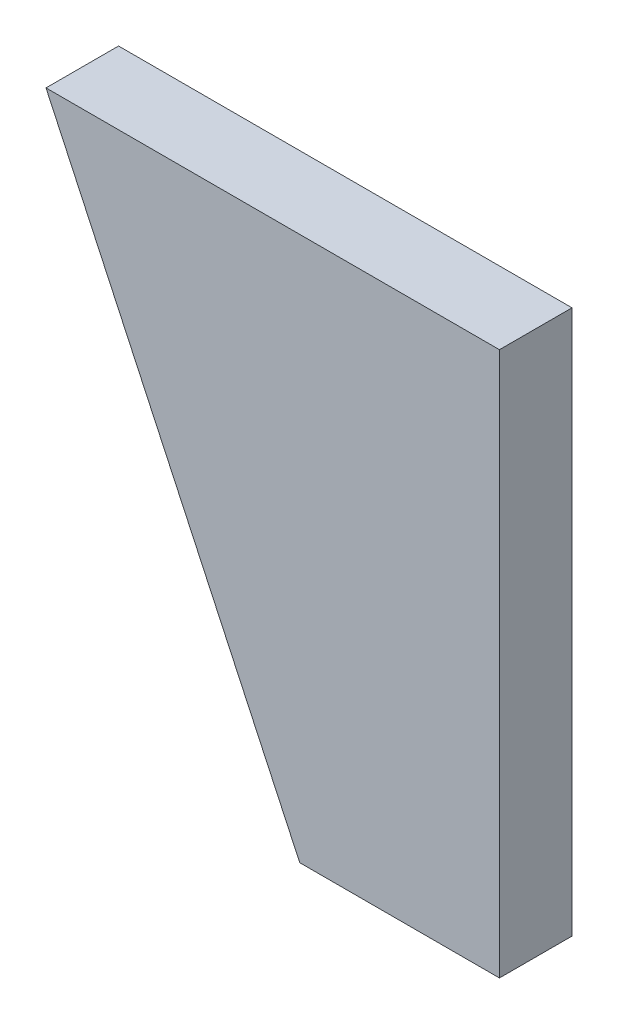
ISO-10303-21;
HEADER;
FILE_DESCRIPTION(('STEP AP214'),'2;1');
FILE_NAME('part.step','',(''),(''),'','','');
FILE_SCHEMA(('AUTOMOTIVE_DESIGN { 1 0 10303 214 1 1 1 1 }'));
ENDSEC;
DATA;
#1=APPLICATION_CONTEXT('core data for automotive mechanical design processes');
#2=APPLICATION_PROTOCOL_DEFINITION('international standard','automotive_design',2000,#1);
#3=PRODUCT_CONTEXT('',#1,'mechanical');
#4=PRODUCT('Part','Part','',(#3));
#5=PRODUCT_RELATED_PRODUCT_CATEGORY('part','',(#4));
#6=PRODUCT_DEFINITION_FORMATION('','',#4);
#7=PRODUCT_DEFINITION_CONTEXT('part definition',#1,'design');
#8=PRODUCT_DEFINITION('design','',#6,#7);
#9=PRODUCT_DEFINITION_SHAPE('','',#8);
#10=(LENGTH_UNIT() NAMED_UNIT(*) SI_UNIT(.MILLI.,.METRE.));
#11=(NAMED_UNIT(*) PLANE_ANGLE_UNIT() SI_UNIT($,.RADIAN.));
#12=(NAMED_UNIT(*) SI_UNIT($,.STERADIAN.) SOLID_ANGLE_UNIT());
#13=UNCERTAINTY_MEASURE_WITH_UNIT(LENGTH_MEASURE(1.E-05),#10,'distance_accuracy_value','');
#14=(GEOMETRIC_REPRESENTATION_CONTEXT(3) GLOBAL_UNCERTAINTY_ASSIGNED_CONTEXT((#13)) GLOBAL_UNIT_ASSIGNED_CONTEXT((#10,
#11,#12)) REPRESENTATION_CONTEXT('',''));
#15=CARTESIAN_POINT('',(0.,0.,0.));
#16=DIRECTION('',(0.,0.,1.));
#17=DIRECTION('',(1.,0.,0.));
#18=AXIS2_PLACEMENT_3D('',#15,#16,#17);
#19=CARTESIAN_POINT('',(41.9892297446501,55.,2.));
#20=DIRECTION('',(0.,1.,0.));
#21=DIRECTION('',(0.,0.,1.));
#22=AXIS2_PLACEMENT_3D('',#19,#20,#21);
#23=PLANE('',#22);
#24=DIRECTION('',(1.,0.,0.));
#25=VECTOR('',#24,1.);
#26=CARTESIAN_POINT('',(41.9892297446501,55.,-2.));
#27=LINE('',#26,#25);
#28=CARTESIAN_POINT('',(41.9892297446501,55.,-2.));
#29=VERTEX_POINT('',#28);
#30=CARTESIAN_POINT('',(53.,55.,-2.));
#31=VERTEX_POINT('',#30);
#32=EDGE_CURVE('E98',#29,#31,#27,.T.);
#33=ORIENTED_EDGE('',*,*,#32,.T.);
#34=DIRECTION('',(0.,0.,-1.));
#35=VECTOR('',#34,1.);
#36=CARTESIAN_POINT('',(53.,55.,2.));
#37=LINE('',#36,#35);
#38=CARTESIAN_POINT('',(53.,55.,2.));
#39=VERTEX_POINT('',#38);
#40=EDGE_CURVE('E11',#39,#31,#37,.T.);
#41=ORIENTED_EDGE('',*,*,#40,.F.);
#42=DIRECTION('',(1.,0.,0.));
#43=VECTOR('',#42,1.);
#44=CARTESIAN_POINT('',(41.9892297446501,55.,2.));
#45=LINE('',#44,#43);
#46=CARTESIAN_POINT('',(41.9892297446501,55.,2.));
#47=VERTEX_POINT('',#46);
#48=EDGE_CURVE('E77',#47,#39,#45,.T.);
#49=ORIENTED_EDGE('',*,*,#48,.F.);
#50=DIRECTION('',(0.,0.,-1.));
#51=VECTOR('',#50,1.);
#52=CARTESIAN_POINT('',(41.9892297446501,55.,2.));
#53=LINE('',#52,#51);
#54=EDGE_CURVE('E97',#47,#29,#53,.T.);
#55=ORIENTED_EDGE('',*,*,#54,.T.);
#56=EDGE_LOOP('',(#33,#41,#49,#55));
#57=FACE_BOUND('',#56,.T.);
#58=ADVANCED_FACE('F35',(#57),#23,.F.);
#59=CARTESIAN_POINT('',(53.,85.,2.));
#60=DIRECTION('',(1.,0.,0.));
#61=DIRECTION('',(0.,1.,0.));
#62=AXIS2_PLACEMENT_3D('',#59,#60,#61);
#63=PLANE('',#62);
#64=DIRECTION('',(0.,-1.,0.));
#65=VECTOR('',#64,1.);
#66=CARTESIAN_POINT('',(53.,85.,-2.));
#67=LINE('',#66,#65);
#68=CARTESIAN_POINT('',(53.,85.,-2.));
#69=VERTEX_POINT('',#68);
#70=EDGE_CURVE('E87',#69,#31,#67,.T.);
#71=ORIENTED_EDGE('',*,*,#70,.F.);
#72=DIRECTION('',(0.,0.,-1.));
#73=VECTOR('',#72,1.);
#74=CARTESIAN_POINT('',(53.,85.,2.));
#75=LINE('',#74,#73);
#76=CARTESIAN_POINT('',(53.,85.,2.));
#77=VERTEX_POINT('',#76);
#78=EDGE_CURVE('E43',#77,#69,#75,.T.);
#79=ORIENTED_EDGE('',*,*,#78,.F.);
#80=DIRECTION('',(0.,-1.,0.));
#81=VECTOR('',#80,1.);
#82=CARTESIAN_POINT('',(53.,85.,2.));
#83=LINE('',#82,#81);
#84=EDGE_CURVE('E85',#77,#39,#83,.T.);
#85=ORIENTED_EDGE('',*,*,#84,.T.);
#86=ORIENTED_EDGE('',*,*,#40,.T.);
#87=EDGE_LOOP('',(#71,#79,#85,#86));
#88=FACE_BOUND('',#87,.T.);
#89=ADVANCED_FACE('F84',(#88),#63,.T.);
#90=CARTESIAN_POINT('',(53.,85.,2.));
#91=DIRECTION('',(0.,-1.,0.));
#92=DIRECTION('',(0.,0.,-1.));
#93=AXIS2_PLACEMENT_3D('',#90,#91,#92);
#94=PLANE('',#93);
#95=DIRECTION('',(-1.,0.,0.));
#96=VECTOR('',#95,1.);
#97=CARTESIAN_POINT('',(53.,85.,-2.));
#98=LINE('',#97,#96);
#99=CARTESIAN_POINT('',(28.,85.,-2.));
#100=VERTEX_POINT('',#99);
#101=EDGE_CURVE('E66',#69,#100,#98,.T.);
#102=ORIENTED_EDGE('',*,*,#101,.T.);
#103=DIRECTION('',(0.,0.,-1.));
#104=VECTOR('',#103,1.);
#105=CARTESIAN_POINT('',(28.,85.,2.));
#106=LINE('',#105,#104);
#107=CARTESIAN_POINT('',(28.,85.,2.));
#108=VERTEX_POINT('',#107);
#109=EDGE_CURVE('E88',#108,#100,#106,.T.);
#110=ORIENTED_EDGE('',*,*,#109,.F.);
#111=DIRECTION('',(-1.,0.,0.));
#112=VECTOR('',#111,1.);
#113=CARTESIAN_POINT('',(53.,85.,2.));
#114=LINE('',#113,#112);
#115=EDGE_CURVE('E89',#77,#108,#114,.T.);
#116=ORIENTED_EDGE('',*,*,#115,.F.);
#117=ORIENTED_EDGE('',*,*,#78,.T.);
#118=EDGE_LOOP('',(#102,#110,#116,#117));
#119=FACE_BOUND('',#118,.T.);
#120=ADVANCED_FACE('F90',(#119),#94,.F.);
#121=CARTESIAN_POINT('',(28.,85.,2.));
#122=DIRECTION('',(0.906307787036649,0.422618261740701,0.));
#123=DIRECTION('',(-0.422618261740701,0.906307787036649,0.));
#124=AXIS2_PLACEMENT_3D('',#121,#122,#123);
#125=PLANE('',#124);
#126=DIRECTION('',(0.422618261740701,-0.906307787036649,0.));
#127=VECTOR('',#126,1.);
#128=CARTESIAN_POINT('',(28.,85.,-2.));
#129=LINE('',#128,#127);
#130=EDGE_CURVE('E72',#100,#29,#129,.T.);
#131=ORIENTED_EDGE('',*,*,#130,.T.);
#132=ORIENTED_EDGE('',*,*,#54,.F.);
#133=DIRECTION('',(0.422618261740701,-0.906307787036649,0.));
#134=VECTOR('',#133,1.);
#135=CARTESIAN_POINT('',(28.,85.,2.));
#136=LINE('',#135,#134);
#137=EDGE_CURVE('E51',#108,#47,#136,.T.);
#138=ORIENTED_EDGE('',*,*,#137,.F.);
#139=ORIENTED_EDGE('',*,*,#109,.T.);
#140=EDGE_LOOP('',(#131,#132,#138,#139));
#141=FACE_BOUND('',#140,.T.);
#142=ADVANCED_FACE('F105',(#141),#125,.F.);
#143=CARTESIAN_POINT('',(0.,0.,2.));
#144=DIRECTION('',(0.,0.,-1.));
#145=DIRECTION('',(-1.,0.,0.));
#146=AXIS2_PLACEMENT_3D('',#143,#144,#145);
#147=PLANE('',#146);
#148=ORIENTED_EDGE('',*,*,#48,.T.);
#149=ORIENTED_EDGE('',*,*,#84,.F.);
#150=ORIENTED_EDGE('',*,*,#115,.T.);
#151=ORIENTED_EDGE('',*,*,#137,.T.);
#152=EDGE_LOOP('',(#148,#149,#150,#151));
#153=FACE_BOUND('',#152,.T.);
#154=ADVANCED_FACE('F92',(#153),#147,.F.);
#155=CARTESIAN_POINT('',(0.,0.,-2.));
#156=DIRECTION('',(0.,0.,-1.));
#157=DIRECTION('',(-1.,0.,0.));
#158=AXIS2_PLACEMENT_3D('',#155,#156,#157);
#159=PLANE('',#158);
#160=ORIENTED_EDGE('',*,*,#32,.F.);
#161=ORIENTED_EDGE('',*,*,#130,.F.);
#162=ORIENTED_EDGE('',*,*,#101,.F.);
#163=ORIENTED_EDGE('',*,*,#70,.T.);
#164=EDGE_LOOP('',(#160,#161,#162,#163));
#165=FACE_BOUND('',#164,.T.);
#166=ADVANCED_FACE('F108',(#165),#159,.T.);
#167=CLOSED_SHELL('',(#58,#89,#120,#142,#154,#166));
#168=MANIFOLD_SOLID_BREP('B2',#167);
#169=ADVANCED_BREP_SHAPE_REPRESENTATION('',(#18,#168),#14);
#170=SHAPE_DEFINITION_REPRESENTATION(#9,#169);
ENDSEC;
END-ISO-10303-21;
